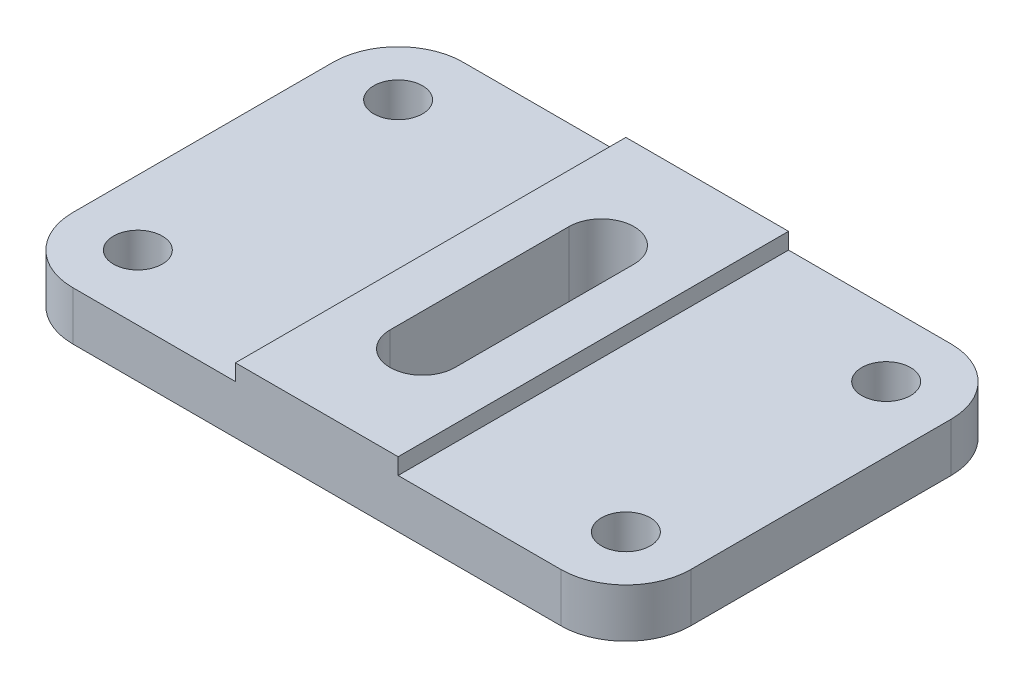
ISO-10303-21;
HEADER;
FILE_DESCRIPTION(('STEP AP214'),'2;1');
FILE_NAME('part.step','',(''),(''),'','','');
FILE_SCHEMA(('AUTOMOTIVE_DESIGN { 1 0 10303 214 1 1 1 1 }'));
ENDSEC;
DATA;
#1=APPLICATION_CONTEXT('core data for automotive mechanical design processes');
#2=APPLICATION_PROTOCOL_DEFINITION('international standard','automotive_design',2000,#1);
#3=PRODUCT_CONTEXT('',#1,'mechanical');
#4=PRODUCT('Part','Part','',(#3));
#5=PRODUCT_RELATED_PRODUCT_CATEGORY('part','',(#4));
#6=PRODUCT_DEFINITION_FORMATION('','',#4);
#7=PRODUCT_DEFINITION_CONTEXT('part definition',#1,'design');
#8=PRODUCT_DEFINITION('design','',#6,#7);
#9=PRODUCT_DEFINITION_SHAPE('','',#8);
#10=(LENGTH_UNIT() NAMED_UNIT(*) SI_UNIT(.MILLI.,.METRE.));
#11=(NAMED_UNIT(*) PLANE_ANGLE_UNIT() SI_UNIT($,.RADIAN.));
#12=(NAMED_UNIT(*) SI_UNIT($,.STERADIAN.) SOLID_ANGLE_UNIT());
#13=UNCERTAINTY_MEASURE_WITH_UNIT(LENGTH_MEASURE(1.E-05),#10,'distance_accuracy_value','');
#14=(GEOMETRIC_REPRESENTATION_CONTEXT(3) GLOBAL_UNCERTAINTY_ASSIGNED_CONTEXT((#13)) GLOBAL_UNIT_ASSIGNED_CONTEXT((#10,
#11,#12)) REPRESENTATION_CONTEXT('',''));
#15=CARTESIAN_POINT('',(0.,0.,0.));
#16=DIRECTION('',(0.,0.,1.));
#17=DIRECTION('',(1.,0.,0.));
#18=AXIS2_PLACEMENT_3D('',#15,#16,#17);
#19=CARTESIAN_POINT('',(-143.340592334495,-11.5243902439024,120.));
#20=DIRECTION('',(0.,1.,0.));
#21=DIRECTION('',(-1.,0.,0.));
#22=AXIS2_PLACEMENT_3D('',#19,#20,#21);
#23=PLANE('',#22);
#24=CARTESIAN_POINT('',(-123.340592334495,-11.5243902439024,100.));
#25=DIRECTION('',(0.,1.,0.));
#26=DIRECTION('',(0.,0.,1.));
#27=AXIS2_PLACEMENT_3D('',#24,#25,#26);
#28=CIRCLE('',#27,7.50000000000001);
#29=CARTESIAN_POINT('',(-123.340592334495,-11.5243902439024,107.5));
#30=VERTEX_POINT('',#29);
#31=EDGE_CURVE('E481',#30,#30,#28,.T.);
#32=ORIENTED_EDGE('',*,*,#31,.T.);
#33=EDGE_LOOP('',(#32));
#34=FACE_BOUND('',#33,.T.);
#35=CARTESIAN_POINT('',(26.6594076655053,-11.5243902439024,100.));
#36=DIRECTION('',(0.,-1.,0.));
#37=DIRECTION('',(0.,0.,-1.));
#38=AXIS2_PLACEMENT_3D('',#35,#36,#37);
#39=CIRCLE('',#38,7.50000000000001);
#40=CARTESIAN_POINT('',(26.6594076655053,-11.5243902439024,92.5));
#41=VERTEX_POINT('',#40);
#42=EDGE_CURVE('E467',#41,#41,#39,.T.);
#43=ORIENTED_EDGE('',*,*,#42,.F.);
#44=EDGE_LOOP('',(#43));
#45=FACE_BOUND('',#44,.T.);
#46=CARTESIAN_POINT('',(26.6594076655053,-11.5243902439024,20.));
#47=DIRECTION('',(0.,-1.,0.));
#48=DIRECTION('',(0.,0.,-1.));
#49=AXIS2_PLACEMENT_3D('',#46,#47,#48);
#50=CIRCLE('',#49,7.50000000000001);
#51=CARTESIAN_POINT('',(26.6594076655053,-11.5243902439024,12.5));
#52=VERTEX_POINT('',#51);
#53=EDGE_CURVE('E195',#52,#52,#50,.T.);
#54=ORIENTED_EDGE('',*,*,#53,.F.);
#55=EDGE_LOOP('',(#54));
#56=FACE_BOUND('',#55,.T.);
#57=DIRECTION('',(0.,0.,-1.));
#58=VECTOR('',#57,1.);
#59=CARTESIAN_POINT('',(-38.3405923344948,-11.5243902439024,32.5));
#60=LINE('',#59,#58);
#61=CARTESIAN_POINT('',(-38.3405923344948,-11.5243902439024,87.5));
#62=VERTEX_POINT('',#61);
#63=CARTESIAN_POINT('',(-38.3405923344948,-11.5243902439024,32.5));
#64=VERTEX_POINT('',#63);
#65=EDGE_CURVE('E167',#62,#64,#60,.T.);
#66=ORIENTED_EDGE('',*,*,#65,.T.);
#67=CARTESIAN_POINT('',(-48.3405923344948,-11.5243902439024,32.5));
#68=DIRECTION('',(0.,1.,0.));
#69=DIRECTION('',(-1.,0.,0.));
#70=AXIS2_PLACEMENT_3D('',#67,#68,#69);
#71=CIRCLE('',#70,9.99999999999997);
#72=CARTESIAN_POINT('',(-58.3405923344947,-11.5243902439024,32.5));
#73=VERTEX_POINT('',#72);
#74=EDGE_CURVE('E160',#64,#73,#71,.T.);
#75=ORIENTED_EDGE('',*,*,#74,.T.);
#76=DIRECTION('',(0.,0.,1.));
#77=VECTOR('',#76,1.);
#78=CARTESIAN_POINT('',(-58.3405923344947,-11.5243902439024,32.5));
#79=LINE('',#78,#77);
#80=CARTESIAN_POINT('',(-58.3405923344947,-11.5243902439024,87.5));
#81=VERTEX_POINT('',#80);
#82=EDGE_CURVE('E170',#73,#81,#79,.T.);
#83=ORIENTED_EDGE('',*,*,#82,.T.);
#84=CARTESIAN_POINT('',(-48.3405923344947,-11.5243902439024,87.5));
#85=DIRECTION('',(0.,1.,0.));
#86=DIRECTION('',(-1.,0.,0.));
#87=AXIS2_PLACEMENT_3D('',#84,#85,#86);
#88=CIRCLE('',#87,9.99999999999997);
#89=EDGE_CURVE('E61',#81,#62,#88,.T.);
#90=ORIENTED_EDGE('',*,*,#89,.T.);
#91=EDGE_LOOP('',(#66,#75,#83,#90));
#92=FACE_BOUND('',#91,.T.);
#93=DIRECTION('',(0.,0.,-1.));
#94=VECTOR('',#93,1.);
#95=CARTESIAN_POINT('',(46.6594076655052,-11.5243902439024,120.));
#96=LINE('',#95,#94);
#97=CARTESIAN_POINT('',(46.6594076655052,-11.5243902439024,100.));
#98=VERTEX_POINT('',#97);
#99=CARTESIAN_POINT('',(46.6594076655052,-11.5243902439024,20.));
#100=VERTEX_POINT('',#99);
#101=EDGE_CURVE('E273',#98,#100,#96,.T.);
#102=ORIENTED_EDGE('',*,*,#101,.F.);
#103=CARTESIAN_POINT('',(26.6594076655052,-11.5243902439024,100.));
#104=DIRECTION('',(0.,1.,0.));
#105=DIRECTION('',(-1.,0.,0.));
#106=AXIS2_PLACEMENT_3D('',#103,#104,#105);
#107=CIRCLE('',#106,20.);
#108=CARTESIAN_POINT('',(26.6594076655053,-11.5243902439024,120.));
#109=VERTEX_POINT('',#108);
#110=EDGE_CURVE('E311',#98,#109,#107,.F.);
#111=ORIENTED_EDGE('',*,*,#110,.T.);
#112=DIRECTION('',(1.,0.,0.));
#113=VECTOR('',#112,1.);
#114=CARTESIAN_POINT('',(-143.340592334495,-11.5243902439024,120.));
#115=LINE('',#114,#113);
#116=CARTESIAN_POINT('',(-123.340592334495,-11.5243902439024,120.));
#117=VERTEX_POINT('',#116);
#118=EDGE_CURVE('E210',#117,#109,#115,.T.);
#119=ORIENTED_EDGE('',*,*,#118,.F.);
#120=CARTESIAN_POINT('',(-123.340592334495,-11.5243902439024,100.));
#121=DIRECTION('',(0.,1.,0.));
#122=DIRECTION('',(-1.,0.,0.));
#123=AXIS2_PLACEMENT_3D('',#120,#121,#122);
#124=CIRCLE('',#123,20.);
#125=CARTESIAN_POINT('',(-143.340592334495,-11.5243902439024,100.));
#126=VERTEX_POINT('',#125);
#127=EDGE_CURVE('E305',#117,#126,#124,.F.);
#128=ORIENTED_EDGE('',*,*,#127,.T.);
#129=DIRECTION('',(0.,0.,-1.));
#130=VECTOR('',#129,1.);
#131=CARTESIAN_POINT('',(-143.340592334495,-11.5243902439024,120.));
#132=LINE('',#131,#130);
#133=CARTESIAN_POINT('',(-143.340592334495,-11.5243902439024,20.));
#134=VERTEX_POINT('',#133);
#135=EDGE_CURVE('E277',#126,#134,#132,.T.);
#136=ORIENTED_EDGE('',*,*,#135,.T.);
#137=CARTESIAN_POINT('',(-123.340592334495,-11.5243902439024,20.));
#138=DIRECTION('',(0.,1.,0.));
#139=DIRECTION('',(-1.,0.,0.));
#140=AXIS2_PLACEMENT_3D('',#137,#138,#139);
#141=CIRCLE('',#140,20.);
#142=CARTESIAN_POINT('',(-123.340592334495,-11.5243902439024,0.));
#143=VERTEX_POINT('',#142);
#144=EDGE_CURVE('E302',#134,#143,#141,.F.);
#145=ORIENTED_EDGE('',*,*,#144,.T.);
#146=DIRECTION('',(1.,0.,0.));
#147=VECTOR('',#146,1.);
#148=CARTESIAN_POINT('',(-143.340592334495,-11.5243902439024,0.));
#149=LINE('',#148,#147);
#150=CARTESIAN_POINT('',(26.6594076655053,-11.5243902439024,0.));
#151=VERTEX_POINT('',#150);
#152=EDGE_CURVE('E204',#143,#151,#149,.T.);
#153=ORIENTED_EDGE('',*,*,#152,.T.);
#154=CARTESIAN_POINT('',(26.6594076655052,-11.5243902439024,20.));
#155=DIRECTION('',(0.,1.,0.));
#156=DIRECTION('',(-1.,0.,0.));
#157=AXIS2_PLACEMENT_3D('',#154,#155,#156);
#158=CIRCLE('',#157,20.);
#159=EDGE_CURVE('E308',#151,#100,#158,.F.);
#160=ORIENTED_EDGE('',*,*,#159,.T.);
#161=EDGE_LOOP('',(#102,#111,#119,#128,#136,#145,#153,#160));
#162=FACE_BOUND('',#161,.T.);
#163=CARTESIAN_POINT('',(-123.340592334495,-11.5243902439024,20.));
#164=DIRECTION('',(0.,1.,0.));
#165=DIRECTION('',(0.,0.,1.));
#166=AXIS2_PLACEMENT_3D('',#163,#164,#165);
#167=CIRCLE('',#166,7.50000000000001);
#168=CARTESIAN_POINT('',(-123.340592334495,-11.5243902439024,27.5));
#169=VERTEX_POINT('',#168);
#170=EDGE_CURVE('E488',#169,#169,#167,.T.);
#171=ORIENTED_EDGE('',*,*,#170,.T.);
#172=EDGE_LOOP('',(#171));
#173=FACE_BOUND('',#172,.T.);
#174=ADVANCED_FACE('F45',(#34,#45,#56,#92,#162,#173),#23,.F.);
#175=CARTESIAN_POINT('',(-143.340592334495,3.47560975609756,120.));
#176=DIRECTION('',(1.,0.,0.));
#177=DIRECTION('',(0.,0.,-1.));
#178=AXIS2_PLACEMENT_3D('',#175,#176,#177);
#179=PLANE('',#178);
#180=ORIENTED_EDGE('',*,*,#135,.F.);
#181=DIRECTION('',(0.,-1.,0.));
#182=VECTOR('',#181,1.);
#183=CARTESIAN_POINT('',(-143.340592334495,3.47560975609756,100.));
#184=LINE('',#183,#182);
#185=CARTESIAN_POINT('',(-143.340592334495,3.47560975609756,100.));
#186=VERTEX_POINT('',#185);
#187=EDGE_CURVE('E324',#126,#186,#184,.F.);
#188=ORIENTED_EDGE('',*,*,#187,.T.);
#189=DIRECTION('',(0.,0.,-1.));
#190=VECTOR('',#189,1.);
#191=CARTESIAN_POINT('',(-143.340592334495,3.47560975609756,120.));
#192=LINE('',#191,#190);
#193=CARTESIAN_POINT('',(-143.340592334495,3.47560975609756,20.));
#194=VERTEX_POINT('',#193);
#195=EDGE_CURVE('E231',#186,#194,#192,.T.);
#196=ORIENTED_EDGE('',*,*,#195,.T.);
#197=DIRECTION('',(0.,-1.,0.));
#198=VECTOR('',#197,1.);
#199=CARTESIAN_POINT('',(-143.340592334495,3.47560975609756,20.));
#200=LINE('',#199,#198);
#201=EDGE_CURVE('E320',#194,#134,#200,.T.);
#202=ORIENTED_EDGE('',*,*,#201,.T.);
#203=EDGE_LOOP('',(#180,#188,#196,#202));
#204=FACE_BOUND('',#203,.T.);
#205=ADVANCED_FACE('F338',(#204),#179,.F.);
#206=CARTESIAN_POINT('',(46.6594076655052,3.47560975609756,120.));
#207=DIRECTION('',(-1.,0.,0.));
#208=DIRECTION('',(0.,0.,1.));
#209=AXIS2_PLACEMENT_3D('',#206,#207,#208);
#210=PLANE('',#209);
#211=DIRECTION('',(0.,0.,-1.));
#212=VECTOR('',#211,1.);
#213=CARTESIAN_POINT('',(46.6594076655052,3.47560975609756,120.));
#214=LINE('',#213,#212);
#215=CARTESIAN_POINT('',(46.6594076655052,3.47560975609756,100.));
#216=VERTEX_POINT('',#215);
#217=CARTESIAN_POINT('',(46.6594076655052,3.47560975609756,20.));
#218=VERTEX_POINT('',#217);
#219=EDGE_CURVE('E269',#216,#218,#214,.T.);
#220=ORIENTED_EDGE('',*,*,#219,.F.);
#221=DIRECTION('',(0.,1.,0.));
#222=VECTOR('',#221,1.);
#223=CARTESIAN_POINT('',(46.6594076655052,-11.5243902439024,100.));
#224=LINE('',#223,#222);
#225=EDGE_CURVE('E299',#216,#98,#224,.F.);
#226=ORIENTED_EDGE('',*,*,#225,.T.);
#227=ORIENTED_EDGE('',*,*,#101,.T.);
#228=DIRECTION('',(0.,1.,0.));
#229=VECTOR('',#228,1.);
#230=CARTESIAN_POINT('',(46.6594076655052,3.47560975609756,20.));
#231=LINE('',#230,#229);
#232=EDGE_CURVE('E295',#100,#218,#231,.T.);
#233=ORIENTED_EDGE('',*,*,#232,.T.);
#234=EDGE_LOOP('',(#220,#226,#227,#233));
#235=FACE_BOUND('',#234,.T.);
#236=ADVANCED_FACE('F355',(#235),#210,.F.);
#237=CARTESIAN_POINT('',(-23.3405923344947,3.47560975609756,120.));
#238=DIRECTION('',(0.,-1.,0.));
#239=DIRECTION('',(0.,0.,-1.));
#240=AXIS2_PLACEMENT_3D('',#237,#238,#239);
#241=PLANE('',#240);
#242=CARTESIAN_POINT('',(26.6594076655053,3.47560975609756,100.));
#243=DIRECTION('',(0.,-1.,0.));
#244=DIRECTION('',(0.,0.,-1.));
#245=AXIS2_PLACEMENT_3D('',#242,#243,#244);
#246=CIRCLE('',#245,7.50000000000001);
#247=CARTESIAN_POINT('',(26.6594076655053,3.47560975609756,92.5));
#248=VERTEX_POINT('',#247);
#249=EDGE_CURVE('E469',#248,#248,#246,.T.);
#250=ORIENTED_EDGE('',*,*,#249,.T.);
#251=EDGE_LOOP('',(#250));
#252=FACE_BOUND('',#251,.T.);
#253=CARTESIAN_POINT('',(26.6594076655053,3.47560975609756,20.));
#254=DIRECTION('',(0.,-1.,0.));
#255=DIRECTION('',(0.,0.,-1.));
#256=AXIS2_PLACEMENT_3D('',#253,#254,#255);
#257=CIRCLE('',#256,7.50000000000001);
#258=CARTESIAN_POINT('',(26.6594076655053,3.47560975609756,12.5));
#259=VERTEX_POINT('',#258);
#260=EDGE_CURVE('E185',#259,#259,#257,.T.);
#261=ORIENTED_EDGE('',*,*,#260,.T.);
#262=EDGE_LOOP('',(#261));
#263=FACE_BOUND('',#262,.T.);
#264=DIRECTION('',(-1.,0.,0.));
#265=VECTOR('',#264,1.);
#266=CARTESIAN_POINT('',(-23.3405923344947,3.47560975609756,120.));
#267=LINE('',#266,#265);
#268=CARTESIAN_POINT('',(26.6594076655052,3.47560975609756,120.));
#269=VERTEX_POINT('',#268);
#270=CARTESIAN_POINT('',(-23.3405923344947,3.47560975609756,120.));
#271=VERTEX_POINT('',#270);
#272=EDGE_CURVE('E214',#269,#271,#267,.T.);
#273=ORIENTED_EDGE('',*,*,#272,.F.);
#274=CARTESIAN_POINT('',(26.6594076655052,3.47560975609756,100.));
#275=DIRECTION('',(0.,-1.,0.));
#276=DIRECTION('',(0.,0.,-1.));
#277=AXIS2_PLACEMENT_3D('',#274,#275,#276);
#278=CIRCLE('',#277,20.);
#279=EDGE_CURVE('E292',#269,#216,#278,.F.);
#280=ORIENTED_EDGE('',*,*,#279,.T.);
#281=ORIENTED_EDGE('',*,*,#219,.T.);
#282=CARTESIAN_POINT('',(26.6594076655052,3.47560975609756,20.));
#283=DIRECTION('',(0.,-1.,0.));
#284=DIRECTION('',(0.,0.,-1.));
#285=AXIS2_PLACEMENT_3D('',#282,#283,#284);
#286=CIRCLE('',#285,20.);
#287=CARTESIAN_POINT('',(26.6594076655052,3.47560975609756,0.));
#288=VERTEX_POINT('',#287);
#289=EDGE_CURVE('E289',#218,#288,#286,.F.);
#290=ORIENTED_EDGE('',*,*,#289,.T.);
#291=DIRECTION('',(-1.,0.,0.));
#292=VECTOR('',#291,1.);
#293=CARTESIAN_POINT('',(-23.3405923344947,3.47560975609756,0.));
#294=LINE('',#293,#292);
#295=CARTESIAN_POINT('',(-23.3405923344947,3.47560975609756,0.));
#296=VERTEX_POINT('',#295);
#297=EDGE_CURVE('E235',#288,#296,#294,.T.);
#298=ORIENTED_EDGE('',*,*,#297,.T.);
#299=DIRECTION('',(0.,0.,-1.));
#300=VECTOR('',#299,1.);
#301=CARTESIAN_POINT('',(-23.3405923344947,3.47560975609756,120.));
#302=LINE('',#301,#300);
#303=EDGE_CURVE('E265',#271,#296,#302,.T.);
#304=ORIENTED_EDGE('',*,*,#303,.F.);
#305=EDGE_LOOP('',(#273,#280,#281,#290,#298,#304));
#306=FACE_BOUND('',#305,.T.);
#307=ADVANCED_FACE('F384',(#252,#263,#306),#241,.F.);
#308=CARTESIAN_POINT('',(-23.3405923344947,8.47560975609756,120.));
#309=DIRECTION('',(-1.,0.,0.));
#310=DIRECTION('',(0.,0.,1.));
#311=AXIS2_PLACEMENT_3D('',#308,#309,#310);
#312=PLANE('',#311);
#313=DIRECTION('',(0.,1.,0.));
#314=VECTOR('',#313,1.);
#315=CARTESIAN_POINT('',(-23.3405923344947,8.47560975609756,0.));
#316=LINE('',#315,#314);
#317=CARTESIAN_POINT('',(-23.3405923344947,8.47560975609756,0.));
#318=VERTEX_POINT('',#317);
#319=EDGE_CURVE('E238',#296,#318,#316,.T.);
#320=ORIENTED_EDGE('',*,*,#319,.T.);
#321=DIRECTION('',(0.,0.,-1.));
#322=VECTOR('',#321,1.);
#323=CARTESIAN_POINT('',(-23.3405923344947,8.47560975609756,120.));
#324=LINE('',#323,#322);
#325=CARTESIAN_POINT('',(-23.3405923344947,8.47560975609756,120.));
#326=VERTEX_POINT('',#325);
#327=EDGE_CURVE('E261',#326,#318,#324,.T.);
#328=ORIENTED_EDGE('',*,*,#327,.F.);
#329=DIRECTION('',(0.,1.,0.));
#330=VECTOR('',#329,1.);
#331=CARTESIAN_POINT('',(-23.3405923344947,8.47560975609756,120.));
#332=LINE('',#331,#330);
#333=EDGE_CURVE('E218',#271,#326,#332,.T.);
#334=ORIENTED_EDGE('',*,*,#333,.F.);
#335=ORIENTED_EDGE('',*,*,#303,.T.);
#336=EDGE_LOOP('',(#320,#328,#334,#335));
#337=FACE_BOUND('',#336,.T.);
#338=ADVANCED_FACE('F381',(#337),#312,.F.);
#339=CARTESIAN_POINT('',(-73.3405923344947,8.47560975609756,120.));
#340=DIRECTION('',(0.,-1.,0.));
#341=DIRECTION('',(1.,0.,0.));
#342=AXIS2_PLACEMENT_3D('',#339,#340,#341);
#343=PLANE('',#342);
#344=DIRECTION('',(0.,0.,1.));
#345=VECTOR('',#344,1.);
#346=CARTESIAN_POINT('',(-58.3405923344947,8.47560975609756,32.5));
#347=LINE('',#346,#345);
#348=CARTESIAN_POINT('',(-58.3405923344947,8.47560975609756,32.5));
#349=VERTEX_POINT('',#348);
#350=CARTESIAN_POINT('',(-58.3405923344947,8.47560975609756,87.5));
#351=VERTEX_POINT('',#350);
#352=EDGE_CURVE('E194',#349,#351,#347,.T.);
#353=ORIENTED_EDGE('',*,*,#352,.F.);
#354=CARTESIAN_POINT('',(-48.3405923344948,8.47560975609756,32.5));
#355=DIRECTION('',(0.,1.,0.));
#356=DIRECTION('',(-1.,0.,0.));
#357=AXIS2_PLACEMENT_3D('',#354,#355,#356);
#358=CIRCLE('',#357,9.99999999999997);
#359=CARTESIAN_POINT('',(-38.3405923344948,8.47560975609756,32.5));
#360=VERTEX_POINT('',#359);
#361=EDGE_CURVE('E69',#360,#349,#358,.T.);
#362=ORIENTED_EDGE('',*,*,#361,.F.);
#363=DIRECTION('',(0.,0.,-1.));
#364=VECTOR('',#363,1.);
#365=CARTESIAN_POINT('',(-38.3405923344948,8.47560975609756,32.5));
#366=LINE('',#365,#364);
#367=CARTESIAN_POINT('',(-38.3405923344948,8.47560975609756,87.5));
#368=VERTEX_POINT('',#367);
#369=EDGE_CURVE('E178',#368,#360,#366,.T.);
#370=ORIENTED_EDGE('',*,*,#369,.F.);
#371=CARTESIAN_POINT('',(-48.3405923344947,8.47560975609756,87.5));
#372=DIRECTION('',(0.,1.,0.));
#373=DIRECTION('',(-1.,0.,0.));
#374=AXIS2_PLACEMENT_3D('',#371,#372,#373);
#375=CIRCLE('',#374,9.99999999999997);
#376=EDGE_CURVE('E182',#351,#368,#375,.T.);
#377=ORIENTED_EDGE('',*,*,#376,.F.);
#378=EDGE_LOOP('',(#353,#362,#370,#377));
#379=FACE_BOUND('',#378,.T.);
#380=DIRECTION('',(-1.,0.,0.));
#381=VECTOR('',#380,1.);
#382=CARTESIAN_POINT('',(-73.3405923344947,8.47560975609756,0.));
#383=LINE('',#382,#381);
#384=CARTESIAN_POINT('',(-73.3405923344947,8.47560975609756,0.));
#385=VERTEX_POINT('',#384);
#386=EDGE_CURVE('E241',#318,#385,#383,.T.);
#387=ORIENTED_EDGE('',*,*,#386,.T.);
#388=DIRECTION('',(0.,0.,-1.));
#389=VECTOR('',#388,1.);
#390=CARTESIAN_POINT('',(-73.3405923344947,8.47560975609756,120.));
#391=LINE('',#390,#389);
#392=CARTESIAN_POINT('',(-73.3405923344947,8.47560975609756,120.));
#393=VERTEX_POINT('',#392);
#394=EDGE_CURVE('E257',#393,#385,#391,.T.);
#395=ORIENTED_EDGE('',*,*,#394,.F.);
#396=DIRECTION('',(-1.,0.,0.));
#397=VECTOR('',#396,1.);
#398=CARTESIAN_POINT('',(-73.3405923344947,8.47560975609756,120.));
#399=LINE('',#398,#397);
#400=EDGE_CURVE('E221',#326,#393,#399,.T.);
#401=ORIENTED_EDGE('',*,*,#400,.F.);
#402=ORIENTED_EDGE('',*,*,#327,.T.);
#403=EDGE_LOOP('',(#387,#395,#401,#402));
#404=FACE_BOUND('',#403,.T.);
#405=ADVANCED_FACE('F377',(#379,#404),#343,.F.);
#406=CARTESIAN_POINT('',(-73.3405923344947,8.47560975609756,120.));
#407=DIRECTION('',(1.,0.,0.));
#408=DIRECTION('',(0.,0.,-1.));
#409=AXIS2_PLACEMENT_3D('',#406,#407,#408);
#410=PLANE('',#409);
#411=DIRECTION('',(0.,-1.,0.));
#412=VECTOR('',#411,1.);
#413=CARTESIAN_POINT('',(-73.3405923344947,8.47560975609756,0.));
#414=LINE('',#413,#412);
#415=CARTESIAN_POINT('',(-73.3405923344947,3.47560975609756,0.));
#416=VERTEX_POINT('',#415);
#417=EDGE_CURVE('E244',#385,#416,#414,.T.);
#418=ORIENTED_EDGE('',*,*,#417,.T.);
#419=DIRECTION('',(0.,0.,-1.));
#420=VECTOR('',#419,1.);
#421=CARTESIAN_POINT('',(-73.3405923344947,3.47560975609756,120.));
#422=LINE('',#421,#420);
#423=CARTESIAN_POINT('',(-73.3405923344947,3.47560975609756,120.));
#424=VERTEX_POINT('',#423);
#425=EDGE_CURVE('E253',#424,#416,#422,.T.);
#426=ORIENTED_EDGE('',*,*,#425,.F.);
#427=DIRECTION('',(0.,-1.,0.));
#428=VECTOR('',#427,1.);
#429=CARTESIAN_POINT('',(-73.3405923344947,8.47560975609756,120.));
#430=LINE('',#429,#428);
#431=EDGE_CURVE('E224',#393,#424,#430,.T.);
#432=ORIENTED_EDGE('',*,*,#431,.F.);
#433=ORIENTED_EDGE('',*,*,#394,.T.);
#434=EDGE_LOOP('',(#418,#426,#432,#433));
#435=FACE_BOUND('',#434,.T.);
#436=ADVANCED_FACE('F373',(#435),#410,.F.);
#437=CARTESIAN_POINT('',(-143.340592334495,3.47560975609756,120.));
#438=DIRECTION('',(0.,-1.,0.));
#439=DIRECTION('',(0.,0.,-1.));
#440=AXIS2_PLACEMENT_3D('',#437,#438,#439);
#441=PLANE('',#440);
#442=CARTESIAN_POINT('',(-123.340592334495,3.47560975609756,20.));
#443=DIRECTION('',(0.,1.,0.));
#444=DIRECTION('',(0.,0.,1.));
#445=AXIS2_PLACEMENT_3D('',#442,#443,#444);
#446=CIRCLE('',#445,7.50000000000001);
#447=CARTESIAN_POINT('',(-123.340592334495,3.47560975609756,27.5));
#448=VERTEX_POINT('',#447);
#449=EDGE_CURVE('E484',#448,#448,#446,.T.);
#450=ORIENTED_EDGE('',*,*,#449,.F.);
#451=EDGE_LOOP('',(#450));
#452=FACE_BOUND('',#451,.T.);
#453=CARTESIAN_POINT('',(-123.340592334495,3.47560975609756,100.));
#454=DIRECTION('',(0.,1.,0.));
#455=DIRECTION('',(0.,0.,1.));
#456=AXIS2_PLACEMENT_3D('',#453,#454,#455);
#457=CIRCLE('',#456,7.50000000000001);
#458=CARTESIAN_POINT('',(-123.340592334495,3.47560975609756,107.5));
#459=VERTEX_POINT('',#458);
#460=EDGE_CURVE('E475',#459,#459,#457,.T.);
#461=ORIENTED_EDGE('',*,*,#460,.F.);
#462=EDGE_LOOP('',(#461));
#463=FACE_BOUND('',#462,.T.);
#464=ORIENTED_EDGE('',*,*,#195,.F.);
#465=CARTESIAN_POINT('',(-123.340592334495,3.47560975609756,100.));
#466=DIRECTION('',(0.,-1.,0.));
#467=DIRECTION('',(0.,0.,-1.));
#468=AXIS2_PLACEMENT_3D('',#465,#466,#467);
#469=CIRCLE('',#468,20.);
#470=CARTESIAN_POINT('',(-123.340592334495,3.47560975609756,120.));
#471=VERTEX_POINT('',#470);
#472=EDGE_CURVE('E11',#186,#471,#469,.F.);
#473=ORIENTED_EDGE('',*,*,#472,.T.);
#474=DIRECTION('',(-1.,0.,0.));
#475=VECTOR('',#474,1.);
#476=CARTESIAN_POINT('',(-143.340592334495,3.47560975609756,120.));
#477=LINE('',#476,#475);
#478=EDGE_CURVE('E227',#424,#471,#477,.T.);
#479=ORIENTED_EDGE('',*,*,#478,.F.);
#480=ORIENTED_EDGE('',*,*,#425,.T.);
#481=DIRECTION('',(-1.,0.,0.));
#482=VECTOR('',#481,1.);
#483=CARTESIAN_POINT('',(-143.340592334495,3.47560975609756,0.));
#484=LINE('',#483,#482);
#485=CARTESIAN_POINT('',(-123.340592334495,3.47560975609756,0.));
#486=VERTEX_POINT('',#485);
#487=EDGE_CURVE('E215',#416,#486,#484,.T.);
#488=ORIENTED_EDGE('',*,*,#487,.T.);
#489=CARTESIAN_POINT('',(-123.340592334495,3.47560975609756,20.));
#490=DIRECTION('',(0.,-1.,0.));
#491=DIRECTION('',(0.,0.,-1.));
#492=AXIS2_PLACEMENT_3D('',#489,#490,#491);
#493=CIRCLE('',#492,20.);
#494=EDGE_CURVE('E54',#486,#194,#493,.F.);
#495=ORIENTED_EDGE('',*,*,#494,.T.);
#496=EDGE_LOOP('',(#464,#473,#479,#480,#488,#495));
#497=FACE_BOUND('',#496,.T.);
#498=ADVANCED_FACE('F330',(#452,#463,#497),#441,.F.);
#499=CARTESIAN_POINT('',(0.,0.,120.));
#500=DIRECTION('',(0.,0.,1.));
#501=DIRECTION('',(1.,0.,0.));
#502=AXIS2_PLACEMENT_3D('',#499,#500,#501);
#503=PLANE('',#502);
#504=ORIENTED_EDGE('',*,*,#118,.T.);
#505=DIRECTION('',(0.,1.,0.));
#506=VECTOR('',#505,1.);
#507=CARTESIAN_POINT('',(26.6594076655052,3.47560975609756,120.));
#508=LINE('',#507,#506);
#509=EDGE_CURVE('E285',#109,#269,#508,.T.);
#510=ORIENTED_EDGE('',*,*,#509,.T.);
#511=ORIENTED_EDGE('',*,*,#272,.T.);
#512=ORIENTED_EDGE('',*,*,#333,.T.);
#513=ORIENTED_EDGE('',*,*,#400,.T.);
#514=ORIENTED_EDGE('',*,*,#431,.T.);
#515=ORIENTED_EDGE('',*,*,#478,.T.);
#516=DIRECTION('',(0.,-1.,0.));
#517=VECTOR('',#516,1.);
#518=CARTESIAN_POINT('',(-123.340592334495,-11.5243902439024,120.));
#519=LINE('',#518,#517);
#520=EDGE_CURVE('E281',#471,#117,#519,.T.);
#521=ORIENTED_EDGE('',*,*,#520,.T.);
#522=EDGE_LOOP('',(#504,#510,#511,#512,#513,#514,#515,#521));
#523=FACE_BOUND('',#522,.T.);
#524=ADVANCED_FACE('F362',(#523),#503,.T.);
#525=CARTESIAN_POINT('',(0.,0.,0.));
#526=DIRECTION('',(0.,0.,1.));
#527=DIRECTION('',(1.,0.,0.));
#528=AXIS2_PLACEMENT_3D('',#525,#526,#527);
#529=PLANE('',#528);
#530=ORIENTED_EDGE('',*,*,#297,.F.);
#531=DIRECTION('',(0.,1.,0.));
#532=VECTOR('',#531,1.);
#533=CARTESIAN_POINT('',(26.6594076655052,0.,0.));
#534=LINE('',#533,#532);
#535=EDGE_CURVE('E317',#288,#151,#534,.F.);
#536=ORIENTED_EDGE('',*,*,#535,.T.);
#537=ORIENTED_EDGE('',*,*,#152,.F.);
#538=DIRECTION('',(0.,-1.,0.));
#539=VECTOR('',#538,1.);
#540=CARTESIAN_POINT('',(-123.340592334495,0.,0.));
#541=LINE('',#540,#539);
#542=EDGE_CURVE('E314',#143,#486,#541,.F.);
#543=ORIENTED_EDGE('',*,*,#542,.T.);
#544=ORIENTED_EDGE('',*,*,#487,.F.);
#545=ORIENTED_EDGE('',*,*,#417,.F.);
#546=ORIENTED_EDGE('',*,*,#386,.F.);
#547=ORIENTED_EDGE('',*,*,#319,.F.);
#548=EDGE_LOOP('',(#530,#536,#537,#543,#544,#545,#546,#547));
#549=FACE_BOUND('',#548,.T.);
#550=ADVANCED_FACE('F346',(#549),#529,.F.);
#551=CARTESIAN_POINT('',(26.6594076655052,0.,100.));
#552=DIRECTION('',(0.,-1.,0.));
#553=DIRECTION('',(0.,0.,-1.));
#554=AXIS2_PLACEMENT_3D('',#551,#552,#553);
#555=CYLINDRICAL_SURFACE('',#554,20.);
#556=ORIENTED_EDGE('',*,*,#110,.F.);
#557=ORIENTED_EDGE('',*,*,#225,.F.);
#558=ORIENTED_EDGE('',*,*,#279,.F.);
#559=ORIENTED_EDGE('',*,*,#509,.F.);
#560=EDGE_LOOP('',(#556,#557,#558,#559));
#561=FACE_BOUND('',#560,.T.);
#562=ADVANCED_FACE('F358',(#561),#555,.T.);
#563=CARTESIAN_POINT('',(26.6594076655052,3.47560975609756,20.));
#564=DIRECTION('',(0.,1.,0.));
#565=DIRECTION('',(0.,0.,1.));
#566=AXIS2_PLACEMENT_3D('',#563,#564,#565);
#567=CYLINDRICAL_SURFACE('',#566,20.);
#568=ORIENTED_EDGE('',*,*,#159,.F.);
#569=ORIENTED_EDGE('',*,*,#535,.F.);
#570=ORIENTED_EDGE('',*,*,#289,.F.);
#571=ORIENTED_EDGE('',*,*,#232,.F.);
#572=EDGE_LOOP('',(#568,#569,#570,#571));
#573=FACE_BOUND('',#572,.T.);
#574=ADVANCED_FACE('F350',(#573),#567,.T.);
#575=CARTESIAN_POINT('',(-123.340592334495,0.,100.));
#576=DIRECTION('',(0.,1.,0.));
#577=DIRECTION('',(0.,0.,1.));
#578=AXIS2_PLACEMENT_3D('',#575,#576,#577);
#579=CYLINDRICAL_SURFACE('',#578,20.);
#580=ORIENTED_EDGE('',*,*,#472,.F.);
#581=ORIENTED_EDGE('',*,*,#187,.F.);
#582=ORIENTED_EDGE('',*,*,#127,.F.);
#583=ORIENTED_EDGE('',*,*,#520,.F.);
#584=EDGE_LOOP('',(#580,#581,#582,#583));
#585=FACE_BOUND('',#584,.T.);
#586=ADVANCED_FACE('F367',(#585),#579,.T.);
#587=CARTESIAN_POINT('',(-123.340592334495,3.47560975609756,20.));
#588=DIRECTION('',(0.,-1.,0.));
#589=DIRECTION('',(0.,0.,-1.));
#590=AXIS2_PLACEMENT_3D('',#587,#588,#589);
#591=CYLINDRICAL_SURFACE('',#590,20.);
#592=ORIENTED_EDGE('',*,*,#494,.F.);
#593=ORIENTED_EDGE('',*,*,#542,.F.);
#594=ORIENTED_EDGE('',*,*,#144,.F.);
#595=ORIENTED_EDGE('',*,*,#201,.F.);
#596=EDGE_LOOP('',(#592,#593,#594,#595));
#597=FACE_BOUND('',#596,.T.);
#598=ADVANCED_FACE('F47',(#597),#591,.T.);
#599=CARTESIAN_POINT('',(-48.3405923344948,-11.5243902439024,32.5));
#600=DIRECTION('',(0.,1.,0.));
#601=DIRECTION('',(-1.,0.,0.));
#602=AXIS2_PLACEMENT_3D('',#599,#600,#601);
#603=CYLINDRICAL_SURFACE('',#602,9.99999999999997);
#604=ORIENTED_EDGE('',*,*,#361,.T.);
#605=DIRECTION('',(0.,1.,0.));
#606=VECTOR('',#605,1.);
#607=CARTESIAN_POINT('',(-58.3405923344947,-11.5243902439024,32.5));
#608=LINE('',#607,#606);
#609=EDGE_CURVE('E156',#73,#349,#608,.T.);
#610=ORIENTED_EDGE('',*,*,#609,.F.);
#611=ORIENTED_EDGE('',*,*,#74,.F.);
#612=DIRECTION('',(0.,1.,0.));
#613=VECTOR('',#612,1.);
#614=CARTESIAN_POINT('',(-38.3405923344948,-11.5243902439024,32.5));
#615=LINE('',#614,#613);
#616=EDGE_CURVE('E201',#64,#360,#615,.T.);
#617=ORIENTED_EDGE('',*,*,#616,.T.);
#618=EDGE_LOOP('',(#604,#610,#611,#617));
#619=FACE_BOUND('',#618,.T.);
#620=ADVANCED_FACE('F158',(#619),#603,.F.);
#621=CARTESIAN_POINT('',(-38.3405923344948,-11.5243902439024,32.5));
#622=DIRECTION('',(1.,0.,0.));
#623=DIRECTION('',(0.,0.,-1.));
#624=AXIS2_PLACEMENT_3D('',#621,#622,#623);
#625=PLANE('',#624);
#626=ORIENTED_EDGE('',*,*,#369,.T.);
#627=ORIENTED_EDGE('',*,*,#616,.F.);
#628=ORIENTED_EDGE('',*,*,#65,.F.);
#629=DIRECTION('',(0.,1.,0.));
#630=VECTOR('',#629,1.);
#631=CARTESIAN_POINT('',(-38.3405923344948,-11.5243902439024,87.5));
#632=LINE('',#631,#630);
#633=EDGE_CURVE('E205',#62,#368,#632,.T.);
#634=ORIENTED_EDGE('',*,*,#633,.T.);
#635=EDGE_LOOP('',(#626,#627,#628,#634));
#636=FACE_BOUND('',#635,.T.);
#637=ADVANCED_FACE('F419',(#636),#625,.F.);
#638=CARTESIAN_POINT('',(-48.3405923344947,-11.5243902439024,87.5));
#639=DIRECTION('',(0.,1.,0.));
#640=DIRECTION('',(-1.,0.,0.));
#641=AXIS2_PLACEMENT_3D('',#638,#639,#640);
#642=CYLINDRICAL_SURFACE('',#641,9.99999999999997);
#643=ORIENTED_EDGE('',*,*,#376,.T.);
#644=ORIENTED_EDGE('',*,*,#633,.F.);
#645=ORIENTED_EDGE('',*,*,#89,.F.);
#646=DIRECTION('',(0.,1.,0.));
#647=VECTOR('',#646,1.);
#648=CARTESIAN_POINT('',(-58.3405923344947,-11.5243902439024,87.5));
#649=LINE('',#648,#647);
#650=EDGE_CURVE('E166',#81,#351,#649,.T.);
#651=ORIENTED_EDGE('',*,*,#650,.T.);
#652=EDGE_LOOP('',(#643,#644,#645,#651));
#653=FACE_BOUND('',#652,.T.);
#654=ADVANCED_FACE('F424',(#653),#642,.F.);
#655=CARTESIAN_POINT('',(-58.3405923344947,-11.5243902439024,32.5));
#656=DIRECTION('',(-1.,0.,0.));
#657=DIRECTION('',(0.,0.,1.));
#658=AXIS2_PLACEMENT_3D('',#655,#656,#657);
#659=PLANE('',#658);
#660=ORIENTED_EDGE('',*,*,#352,.T.);
#661=ORIENTED_EDGE('',*,*,#650,.F.);
#662=ORIENTED_EDGE('',*,*,#82,.F.);
#663=ORIENTED_EDGE('',*,*,#609,.T.);
#664=EDGE_LOOP('',(#660,#661,#662,#663));
#665=FACE_BOUND('',#664,.T.);
#666=ADVANCED_FACE('F171',(#665),#659,.F.);
#667=CARTESIAN_POINT('',(-123.340592334495,-11.5243902439024,100.));
#668=DIRECTION('',(0.,1.,0.));
#669=DIRECTION('',(0.,0.,1.));
#670=AXIS2_PLACEMENT_3D('',#667,#668,#669);
#671=CYLINDRICAL_SURFACE('',#670,7.50000000000001);
#672=ORIENTED_EDGE('',*,*,#31,.F.);
#673=EDGE_LOOP('',(#672));
#674=FACE_BOUND('',#673,.T.);
#675=ORIENTED_EDGE('',*,*,#460,.T.);
#676=EDGE_LOOP('',(#675));
#677=FACE_BOUND('',#676,.T.);
#678=ADVANCED_FACE('F446',(#674,#677),#671,.F.);
#679=CARTESIAN_POINT('',(-123.340592334495,-11.5243902439024,20.));
#680=DIRECTION('',(0.,1.,0.));
#681=DIRECTION('',(0.,0.,1.));
#682=AXIS2_PLACEMENT_3D('',#679,#680,#681);
#683=CYLINDRICAL_SURFACE('',#682,7.50000000000001);
#684=ORIENTED_EDGE('',*,*,#170,.F.);
#685=EDGE_LOOP('',(#684));
#686=FACE_BOUND('',#685,.T.);
#687=ORIENTED_EDGE('',*,*,#449,.T.);
#688=EDGE_LOOP('',(#687));
#689=FACE_BOUND('',#688,.T.);
#690=ADVANCED_FACE('F452',(#686,#689),#683,.F.);
#691=CARTESIAN_POINT('',(26.6594076655053,-11.5243902439024,20.));
#692=DIRECTION('',(0.,1.,0.));
#693=DIRECTION('',(0.,0.,1.));
#694=AXIS2_PLACEMENT_3D('',#691,#692,#693);
#695=CYLINDRICAL_SURFACE('',#694,7.50000000000001);
#696=ORIENTED_EDGE('',*,*,#53,.T.);
#697=EDGE_LOOP('',(#696));
#698=FACE_BOUND('',#697,.T.);
#699=ORIENTED_EDGE('',*,*,#260,.F.);
#700=EDGE_LOOP('',(#699));
#701=FACE_BOUND('',#700,.T.);
#702=ADVANCED_FACE('F448',(#698,#701),#695,.F.);
#703=CARTESIAN_POINT('',(26.6594076655053,-11.5243902439024,100.));
#704=DIRECTION('',(0.,1.,0.));
#705=DIRECTION('',(0.,0.,1.));
#706=AXIS2_PLACEMENT_3D('',#703,#704,#705);
#707=CYLINDRICAL_SURFACE('',#706,7.50000000000001);
#708=ORIENTED_EDGE('',*,*,#42,.T.);
#709=EDGE_LOOP('',(#708));
#710=FACE_BOUND('',#709,.T.);
#711=ORIENTED_EDGE('',*,*,#249,.F.);
#712=EDGE_LOOP('',(#711));
#713=FACE_BOUND('',#712,.T.);
#714=ADVANCED_FACE('F451',(#710,#713),#707,.F.);
#715=CLOSED_SHELL('',(#174,#205,#236,#307,#338,#405,#436,#498,#524,#550,#562,#574,#586,#598,
#620,#637,#654,#666,#678,#690,#702,#714));
#716=MANIFOLD_SOLID_BREP('B2',#715);
#717=ADVANCED_BREP_SHAPE_REPRESENTATION('',(#18,#716),#14);
#718=SHAPE_DEFINITION_REPRESENTATION(#9,#717);
ENDSEC;
END-ISO-10303-21;
